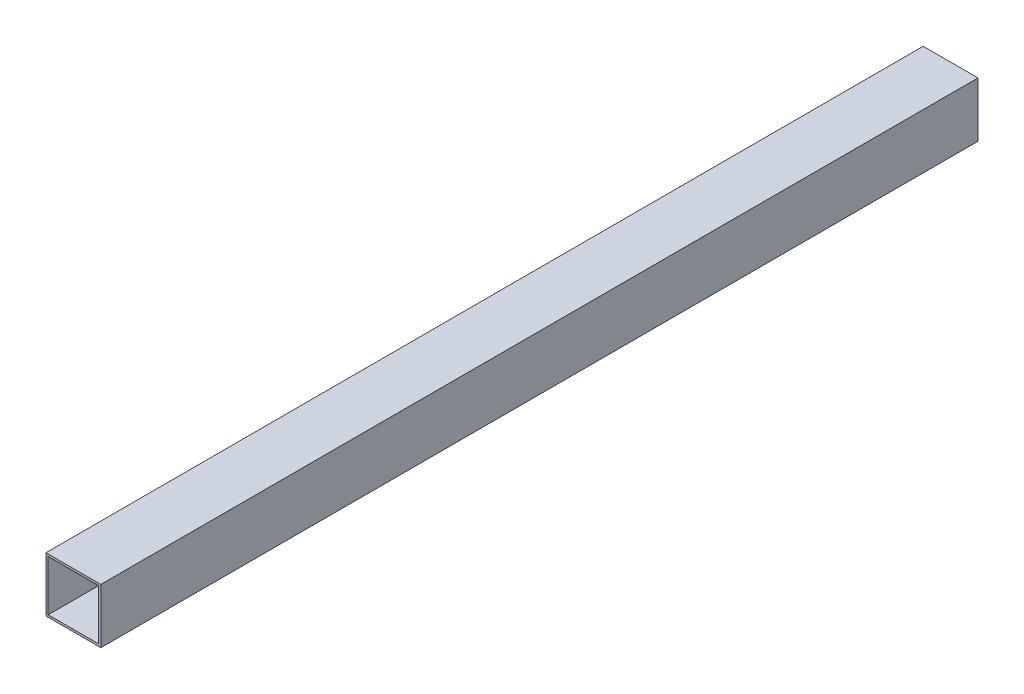
ISO-10303-21;
HEADER;
FILE_DESCRIPTION(('STEP AP214'),'2;1');
FILE_NAME('part.step','',(''),(''),'','','');
FILE_SCHEMA(('AUTOMOTIVE_DESIGN { 1 0 10303 214 1 1 1 1 }'));
ENDSEC;
DATA;
#1=APPLICATION_CONTEXT('core data for automotive mechanical design processes');
#2=APPLICATION_PROTOCOL_DEFINITION('international standard','automotive_design',2000,#1);
#3=PRODUCT_CONTEXT('',#1,'mechanical');
#4=PRODUCT('Part','Part','',(#3));
#5=PRODUCT_RELATED_PRODUCT_CATEGORY('part','',(#4));
#6=PRODUCT_DEFINITION_FORMATION('','',#4);
#7=PRODUCT_DEFINITION_CONTEXT('part definition',#1,'design');
#8=PRODUCT_DEFINITION('design','',#6,#7);
#9=PRODUCT_DEFINITION_SHAPE('','',#8);
#10=(LENGTH_UNIT() NAMED_UNIT(*) SI_UNIT(.MILLI.,.METRE.));
#11=(NAMED_UNIT(*) PLANE_ANGLE_UNIT() SI_UNIT($,.RADIAN.));
#12=(NAMED_UNIT(*) SI_UNIT($,.STERADIAN.) SOLID_ANGLE_UNIT());
#13=UNCERTAINTY_MEASURE_WITH_UNIT(LENGTH_MEASURE(1.E-05),#10,'distance_accuracy_value','');
#14=(GEOMETRIC_REPRESENTATION_CONTEXT(3) GLOBAL_UNCERTAINTY_ASSIGNED_CONTEXT((#13)) GLOBAL_UNIT_ASSIGNED_CONTEXT((#10,
#11,#12)) REPRESENTATION_CONTEXT('',''));
#15=CARTESIAN_POINT('',(0.,0.,0.));
#16=DIRECTION('',(0.,0.,1.));
#17=DIRECTION('',(1.,0.,0.));
#18=AXIS2_PLACEMENT_3D('',#15,#16,#17);
#19=CARTESIAN_POINT('',(792.,685.,0.));
#20=DIRECTION('',(-1.,0.,0.));
#21=DIRECTION('',(0.,-1.,0.));
#22=AXIS2_PLACEMENT_3D('',#19,#20,#21);
#23=PLANE('',#22);
#24=DIRECTION('',(0.,-1.,0.));
#25=VECTOR('',#24,1.);
#26=CARTESIAN_POINT('',(792.,662.,0.));
#27=LINE('',#26,#25);
#28=CARTESIAN_POINT('',(792.,685.,0.));
#29=VERTEX_POINT('',#28);
#30=CARTESIAN_POINT('',(792.,639.,0.));
#31=VERTEX_POINT('',#30);
#32=EDGE_CURVE('E116',#29,#31,#27,.T.);
#33=ORIENTED_EDGE('',*,*,#32,.F.);
#34=DIRECTION('',(0.,0.,1.));
#35=VECTOR('',#34,1.);
#36=CARTESIAN_POINT('',(792.,685.,400.));
#37=LINE('',#36,#35);
#38=CARTESIAN_POINT('',(792.,685.,800.));
#39=VERTEX_POINT('',#38);
#40=EDGE_CURVE('E93',#29,#39,#37,.T.);
#41=ORIENTED_EDGE('',*,*,#40,.T.);
#42=DIRECTION('',(0.,-1.,0.));
#43=VECTOR('',#42,1.);
#44=CARTESIAN_POINT('',(792.,662.,800.));
#45=LINE('',#44,#43);
#46=CARTESIAN_POINT('',(792.,639.,800.));
#47=VERTEX_POINT('',#46);
#48=EDGE_CURVE('E103',#39,#47,#45,.T.);
#49=ORIENTED_EDGE('',*,*,#48,.T.);
#50=DIRECTION('',(0.,0.,-1.));
#51=VECTOR('',#50,1.);
#52=CARTESIAN_POINT('',(792.,639.,400.));
#53=LINE('',#52,#51);
#54=EDGE_CURVE('E20',#47,#31,#53,.T.);
#55=ORIENTED_EDGE('',*,*,#54,.T.);
#56=EDGE_LOOP('',(#33,#41,#49,#55));
#57=FACE_BOUND('',#56,.T.);
#58=ADVANCED_FACE('F16',(#57),#23,.F.);
#59=CARTESIAN_POINT('',(792.,639.,800.));
#60=DIRECTION('',(0.,-1.,0.));
#61=DIRECTION('',(0.,0.,-1.));
#62=AXIS2_PLACEMENT_3D('',#59,#60,#61);
#63=PLANE('',#62);
#64=DIRECTION('',(1.,0.,0.));
#65=VECTOR('',#64,1.);
#66=CARTESIAN_POINT('',(815.,639.,0.));
#67=LINE('',#66,#65);
#68=CARTESIAN_POINT('',(838.,639.,0.));
#69=VERTEX_POINT('',#68);
#70=EDGE_CURVE('E117',#31,#69,#67,.T.);
#71=ORIENTED_EDGE('',*,*,#70,.F.);
#72=ORIENTED_EDGE('',*,*,#54,.F.);
#73=DIRECTION('',(1.,0.,0.));
#74=VECTOR('',#73,1.);
#75=CARTESIAN_POINT('',(815.,639.,800.));
#76=LINE('',#75,#74);
#77=CARTESIAN_POINT('',(838.,639.,800.));
#78=VERTEX_POINT('',#77);
#79=EDGE_CURVE('E136',#47,#78,#76,.T.);
#80=ORIENTED_EDGE('',*,*,#79,.T.);
#81=DIRECTION('',(0.,0.,-1.));
#82=VECTOR('',#81,1.);
#83=CARTESIAN_POINT('',(838.,639.,400.));
#84=LINE('',#83,#82);
#85=EDGE_CURVE('E80',#78,#69,#84,.T.);
#86=ORIENTED_EDGE('',*,*,#85,.T.);
#87=EDGE_LOOP('',(#71,#72,#80,#86));
#88=FACE_BOUND('',#87,.T.);
#89=ADVANCED_FACE('F118',(#88),#63,.F.);
#90=CARTESIAN_POINT('',(838.,639.,800.));
#91=DIRECTION('',(1.,0.,0.));
#92=DIRECTION('',(0.,0.,-1.));
#93=AXIS2_PLACEMENT_3D('',#90,#91,#92);
#94=PLANE('',#93);
#95=DIRECTION('',(0.,1.,0.));
#96=VECTOR('',#95,1.);
#97=CARTESIAN_POINT('',(838.,662.,0.));
#98=LINE('',#97,#96);
#99=CARTESIAN_POINT('',(838.,685.,0.));
#100=VERTEX_POINT('',#99);
#101=EDGE_CURVE('E120',#69,#100,#98,.T.);
#102=ORIENTED_EDGE('',*,*,#101,.F.);
#103=ORIENTED_EDGE('',*,*,#85,.F.);
#104=DIRECTION('',(0.,1.,0.));
#105=VECTOR('',#104,1.);
#106=CARTESIAN_POINT('',(838.,662.,800.));
#107=LINE('',#106,#105);
#108=CARTESIAN_POINT('',(838.,685.,800.));
#109=VERTEX_POINT('',#108);
#110=EDGE_CURVE('E100',#78,#109,#107,.T.);
#111=ORIENTED_EDGE('',*,*,#110,.T.);
#112=DIRECTION('',(0.,0.,-1.));
#113=VECTOR('',#112,1.);
#114=CARTESIAN_POINT('',(838.,685.,400.));
#115=LINE('',#114,#113);
#116=EDGE_CURVE('E87',#109,#100,#115,.T.);
#117=ORIENTED_EDGE('',*,*,#116,.T.);
#118=EDGE_LOOP('',(#102,#103,#111,#117));
#119=FACE_BOUND('',#118,.T.);
#120=ADVANCED_FACE('F105',(#119),#94,.F.);
#121=CARTESIAN_POINT('',(838.,685.,0.));
#122=DIRECTION('',(0.,1.,0.));
#123=DIRECTION('',(-1.,0.,0.));
#124=AXIS2_PLACEMENT_3D('',#121,#122,#123);
#125=PLANE('',#124);
#126=DIRECTION('',(-1.,0.,0.));
#127=VECTOR('',#126,1.);
#128=CARTESIAN_POINT('',(815.,685.,0.));
#129=LINE('',#128,#127);
#130=EDGE_CURVE('E92',#100,#29,#129,.T.);
#131=ORIENTED_EDGE('',*,*,#130,.F.);
#132=ORIENTED_EDGE('',*,*,#116,.F.);
#133=DIRECTION('',(-1.,0.,0.));
#134=VECTOR('',#133,1.);
#135=CARTESIAN_POINT('',(815.,685.,800.));
#136=LINE('',#135,#134);
#137=EDGE_CURVE('E90',#109,#39,#136,.T.);
#138=ORIENTED_EDGE('',*,*,#137,.T.);
#139=ORIENTED_EDGE('',*,*,#40,.F.);
#140=EDGE_LOOP('',(#131,#132,#138,#139));
#141=FACE_BOUND('',#140,.T.);
#142=ADVANCED_FACE('F89',(#141),#125,.F.);
#143=CARTESIAN_POINT('',(790.,637.,800.));
#144=DIRECTION('',(1.,0.,0.));
#145=DIRECTION('',(0.,0.,-1.));
#146=AXIS2_PLACEMENT_3D('',#143,#144,#145);
#147=PLANE('',#146);
#148=DIRECTION('',(0.,1.,0.));
#149=VECTOR('',#148,1.);
#150=CARTESIAN_POINT('',(790.,662.,800.));
#151=LINE('',#150,#149);
#152=CARTESIAN_POINT('',(790.,637.,800.));
#153=VERTEX_POINT('',#152);
#154=CARTESIAN_POINT('',(790.,687.,800.));
#155=VERTEX_POINT('',#154);
#156=EDGE_CURVE('E106',#153,#155,#151,.T.);
#157=ORIENTED_EDGE('',*,*,#156,.T.);
#158=DIRECTION('',(0.,0.,-1.));
#159=VECTOR('',#158,1.);
#160=CARTESIAN_POINT('',(790.,687.,400.));
#161=LINE('',#160,#159);
#162=CARTESIAN_POINT('',(790.,687.,0.));
#163=VERTEX_POINT('',#162);
#164=EDGE_CURVE('E130',#155,#163,#161,.T.);
#165=ORIENTED_EDGE('',*,*,#164,.T.);
#166=DIRECTION('',(0.,1.,0.));
#167=VECTOR('',#166,1.);
#168=CARTESIAN_POINT('',(790.,662.,0.));
#169=LINE('',#168,#167);
#170=CARTESIAN_POINT('',(790.,637.,0.));
#171=VERTEX_POINT('',#170);
#172=EDGE_CURVE('E128',#171,#163,#169,.T.);
#173=ORIENTED_EDGE('',*,*,#172,.F.);
#174=DIRECTION('',(0.,0.,1.));
#175=VECTOR('',#174,1.);
#176=CARTESIAN_POINT('',(790.,637.,400.));
#177=LINE('',#176,#175);
#178=EDGE_CURVE('E153',#171,#153,#177,.T.);
#179=ORIENTED_EDGE('',*,*,#178,.T.);
#180=EDGE_LOOP('',(#157,#165,#173,#179));
#181=FACE_BOUND('',#180,.T.);
#182=ADVANCED_FACE('F166',(#181),#147,.F.);
#183=CARTESIAN_POINT('',(840.,637.,800.));
#184=DIRECTION('',(0.,0.,-1.));
#185=DIRECTION('',(-1.,0.,0.));
#186=AXIS2_PLACEMENT_3D('',#183,#184,#185);
#187=PLANE('',#186);
#188=ORIENTED_EDGE('',*,*,#48,.F.);
#189=ORIENTED_EDGE('',*,*,#137,.F.);
#190=ORIENTED_EDGE('',*,*,#110,.F.);
#191=ORIENTED_EDGE('',*,*,#79,.F.);
#192=EDGE_LOOP('',(#188,#189,#190,#191));
#193=FACE_BOUND('',#192,.T.);
#194=DIRECTION('',(0.,1.,0.));
#195=VECTOR('',#194,1.);
#196=CARTESIAN_POINT('',(840.,662.,800.));
#197=LINE('',#196,#195);
#198=CARTESIAN_POINT('',(840.,637.,800.));
#199=VERTEX_POINT('',#198);
#200=CARTESIAN_POINT('',(840.,687.,800.));
#201=VERTEX_POINT('',#200);
#202=EDGE_CURVE('E140',#199,#201,#197,.T.);
#203=ORIENTED_EDGE('',*,*,#202,.T.);
#204=DIRECTION('',(-1.,0.,0.));
#205=VECTOR('',#204,1.);
#206=CARTESIAN_POINT('',(815.,687.,800.));
#207=LINE('',#206,#205);
#208=EDGE_CURVE('E133',#201,#155,#207,.T.);
#209=ORIENTED_EDGE('',*,*,#208,.T.);
#210=ORIENTED_EDGE('',*,*,#156,.F.);
#211=DIRECTION('',(1.,0.,0.));
#212=VECTOR('',#211,1.);
#213=CARTESIAN_POINT('',(815.,637.,800.));
#214=LINE('',#213,#212);
#215=EDGE_CURVE('E159',#153,#199,#214,.T.);
#216=ORIENTED_EDGE('',*,*,#215,.T.);
#217=EDGE_LOOP('',(#203,#209,#210,#216));
#218=FACE_BOUND('',#217,.T.);
#219=ADVANCED_FACE('F97',(#193,#218),#187,.F.);
#220=CARTESIAN_POINT('',(790.,687.,800.));
#221=DIRECTION('',(0.,-1.,0.));
#222=DIRECTION('',(0.,0.,-1.));
#223=AXIS2_PLACEMENT_3D('',#220,#221,#222);
#224=PLANE('',#223);
#225=ORIENTED_EDGE('',*,*,#208,.F.);
#226=DIRECTION('',(0.,0.,-1.));
#227=VECTOR('',#226,1.);
#228=CARTESIAN_POINT('',(840.,687.,400.));
#229=LINE('',#228,#227);
#230=CARTESIAN_POINT('',(840.,687.,0.));
#231=VERTEX_POINT('',#230);
#232=EDGE_CURVE('E147',#201,#231,#229,.T.);
#233=ORIENTED_EDGE('',*,*,#232,.T.);
#234=DIRECTION('',(1.,0.,0.));
#235=VECTOR('',#234,1.);
#236=CARTESIAN_POINT('',(815.,687.,0.));
#237=LINE('',#236,#235);
#238=EDGE_CURVE('E123',#163,#231,#237,.T.);
#239=ORIENTED_EDGE('',*,*,#238,.F.);
#240=ORIENTED_EDGE('',*,*,#164,.F.);
#241=EDGE_LOOP('',(#225,#233,#239,#240));
#242=FACE_BOUND('',#241,.T.);
#243=ADVANCED_FACE('F145',(#242),#224,.F.);
#244=CARTESIAN_POINT('',(840.,637.,0.));
#245=DIRECTION('',(0.,0.,-1.));
#246=DIRECTION('',(-1.,0.,0.));
#247=AXIS2_PLACEMENT_3D('',#244,#245,#246);
#248=PLANE('',#247);
#249=ORIENTED_EDGE('',*,*,#101,.T.);
#250=ORIENTED_EDGE('',*,*,#130,.T.);
#251=ORIENTED_EDGE('',*,*,#32,.T.);
#252=ORIENTED_EDGE('',*,*,#70,.T.);
#253=EDGE_LOOP('',(#249,#250,#251,#252));
#254=FACE_BOUND('',#253,.T.);
#255=ORIENTED_EDGE('',*,*,#172,.T.);
#256=ORIENTED_EDGE('',*,*,#238,.T.);
#257=DIRECTION('',(0.,-1.,0.));
#258=VECTOR('',#257,1.);
#259=CARTESIAN_POINT('',(840.,662.,0.));
#260=LINE('',#259,#258);
#261=CARTESIAN_POINT('',(840.,637.,0.));
#262=VERTEX_POINT('',#261);
#263=EDGE_CURVE('E26',#231,#262,#260,.T.);
#264=ORIENTED_EDGE('',*,*,#263,.T.);
#265=DIRECTION('',(-1.,0.,0.));
#266=VECTOR('',#265,1.);
#267=CARTESIAN_POINT('',(815.,637.,0.));
#268=LINE('',#267,#266);
#269=EDGE_CURVE('E34',#262,#171,#268,.T.);
#270=ORIENTED_EDGE('',*,*,#269,.T.);
#271=EDGE_LOOP('',(#255,#256,#264,#270));
#272=FACE_BOUND('',#271,.T.);
#273=ADVANCED_FACE('F160',(#254,#272),#248,.T.);
#274=CARTESIAN_POINT('',(790.,637.,0.));
#275=DIRECTION('',(0.,1.,0.));
#276=DIRECTION('',(0.,0.,1.));
#277=AXIS2_PLACEMENT_3D('',#274,#275,#276);
#278=PLANE('',#277);
#279=ORIENTED_EDGE('',*,*,#269,.F.);
#280=DIRECTION('',(0.,0.,1.));
#281=VECTOR('',#280,1.);
#282=CARTESIAN_POINT('',(840.,637.,400.));
#283=LINE('',#282,#281);
#284=EDGE_CURVE('E11',#262,#199,#283,.T.);
#285=ORIENTED_EDGE('',*,*,#284,.T.);
#286=ORIENTED_EDGE('',*,*,#215,.F.);
#287=ORIENTED_EDGE('',*,*,#178,.F.);
#288=EDGE_LOOP('',(#279,#285,#286,#287));
#289=FACE_BOUND('',#288,.T.);
#290=ADVANCED_FACE('F163',(#289),#278,.F.);
#291=CARTESIAN_POINT('',(840.,637.,0.));
#292=DIRECTION('',(-1.,0.,0.));
#293=DIRECTION('',(0.,0.,1.));
#294=AXIS2_PLACEMENT_3D('',#291,#292,#293);
#295=PLANE('',#294);
#296=ORIENTED_EDGE('',*,*,#263,.F.);
#297=ORIENTED_EDGE('',*,*,#232,.F.);
#298=ORIENTED_EDGE('',*,*,#202,.F.);
#299=ORIENTED_EDGE('',*,*,#284,.F.);
#300=EDGE_LOOP('',(#296,#297,#298,#299));
#301=FACE_BOUND('',#300,.T.);
#302=ADVANCED_FACE('F18',(#301),#295,.F.);
#303=CLOSED_SHELL('',(#58,#89,#120,#142,#182,#219,#243,#273,#290,#302));
#304=MANIFOLD_SOLID_BREP('B1',#303);
#305=ADVANCED_BREP_SHAPE_REPRESENTATION('',(#18,#304),#14);
#306=SHAPE_DEFINITION_REPRESENTATION(#9,#305);
ENDSEC;
END-ISO-10303-21;
